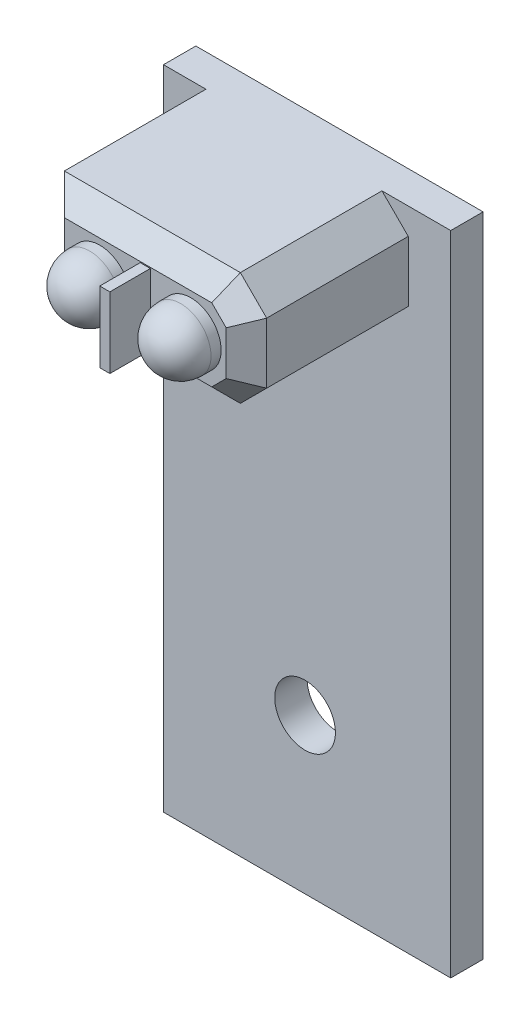
ISO-10303-21;
HEADER;
FILE_DESCRIPTION(('STEP AP214'),'2;1');
FILE_NAME('part.step','',(''),(''),'','','');
FILE_SCHEMA(('AUTOMOTIVE_DESIGN { 1 0 10303 214 1 1 1 1 }'));
ENDSEC;
DATA;
#1=APPLICATION_CONTEXT('core data for automotive mechanical design processes');
#2=APPLICATION_PROTOCOL_DEFINITION('international standard','automotive_design',2000,#1);
#3=PRODUCT_CONTEXT('',#1,'mechanical');
#4=PRODUCT('Part','Part','',(#3));
#5=PRODUCT_RELATED_PRODUCT_CATEGORY('part','',(#4));
#6=PRODUCT_DEFINITION_FORMATION('','',#4);
#7=PRODUCT_DEFINITION_CONTEXT('part definition',#1,'design');
#8=PRODUCT_DEFINITION('design','',#6,#7);
#9=PRODUCT_DEFINITION_SHAPE('','',#8);
#10=(LENGTH_UNIT() NAMED_UNIT(*) SI_UNIT(.MILLI.,.METRE.));
#11=(NAMED_UNIT(*) PLANE_ANGLE_UNIT() SI_UNIT($,.RADIAN.));
#12=(NAMED_UNIT(*) SI_UNIT($,.STERADIAN.) SOLID_ANGLE_UNIT());
#13=UNCERTAINTY_MEASURE_WITH_UNIT(LENGTH_MEASURE(1.E-05),#10,'distance_accuracy_value','');
#14=(GEOMETRIC_REPRESENTATION_CONTEXT(3) GLOBAL_UNCERTAINTY_ASSIGNED_CONTEXT((#13)) GLOBAL_UNIT_ASSIGNED_CONTEXT((#10,
#11,#12)) REPRESENTATION_CONTEXT('',''));
#15=CARTESIAN_POINT('',(0.,0.,0.));
#16=DIRECTION('',(0.,0.,1.));
#17=DIRECTION('',(1.,0.,0.));
#18=AXIS2_PLACEMENT_3D('',#15,#16,#17);
#19=CARTESIAN_POINT('',(0.,0.,0.));
#20=DIRECTION('',(0.,0.,-1.));
#21=DIRECTION('',(-1.,0.,0.));
#22=AXIS2_PLACEMENT_3D('',#19,#20,#21);
#23=PLANE('',#22);
#24=DIRECTION('',(0.,1.,0.));
#25=VECTOR('',#24,1.);
#26=CARTESIAN_POINT('',(7.1,-16.,0.));
#27=LINE('',#26,#25);
#28=CARTESIAN_POINT('',(7.1,-16.,0.));
#29=VERTEX_POINT('',#28);
#30=CARTESIAN_POINT('',(7.1,16.,0.));
#31=VERTEX_POINT('',#30);
#32=EDGE_CURVE('E320',#29,#31,#27,.T.);
#33=ORIENTED_EDGE('',*,*,#32,.F.);
#34=DIRECTION('',(1.,0.,0.));
#35=VECTOR('',#34,1.);
#36=CARTESIAN_POINT('',(-7.1,-16.,0.));
#37=LINE('',#36,#35);
#38=CARTESIAN_POINT('',(-7.1,-16.,0.));
#39=VERTEX_POINT('',#38);
#40=EDGE_CURVE('E328',#39,#29,#37,.T.);
#41=ORIENTED_EDGE('',*,*,#40,.F.);
#42=DIRECTION('',(0.,-1.,0.));
#43=VECTOR('',#42,1.);
#44=CARTESIAN_POINT('',(-7.1,-16.,0.));
#45=LINE('',#44,#43);
#46=CARTESIAN_POINT('',(-7.1,16.,0.));
#47=VERTEX_POINT('',#46);
#48=EDGE_CURVE('E326',#47,#39,#45,.T.);
#49=ORIENTED_EDGE('',*,*,#48,.F.);
#50=DIRECTION('',(-1.,0.,0.));
#51=VECTOR('',#50,1.);
#52=CARTESIAN_POINT('',(-7.1,16.,0.));
#53=LINE('',#52,#51);
#54=EDGE_CURVE('E323',#31,#47,#53,.T.);
#55=ORIENTED_EDGE('',*,*,#54,.F.);
#56=EDGE_LOOP('',(#33,#41,#49,#55));
#57=FACE_BOUND('',#56,.T.);
#58=CARTESIAN_POINT('',(-0.100000000000002,-8.35,0.));
#59=DIRECTION('',(0.,0.,1.));
#60=DIRECTION('',(1.,0.,0.));
#61=AXIS2_PLACEMENT_3D('',#58,#59,#60);
#62=CIRCLE('',#61,1.5);
#63=CARTESIAN_POINT('',(1.4,-8.35,0.));
#64=VERTEX_POINT('',#63);
#65=EDGE_CURVE('E324',#64,#64,#62,.T.);
#66=ORIENTED_EDGE('',*,*,#65,.T.);
#67=EDGE_LOOP('',(#66));
#68=FACE_BOUND('',#67,.T.);
#69=DIRECTION('',(1.,0.,0.));
#70=VECTOR('',#69,1.);
#71=CARTESIAN_POINT('',(0.399999999999997,4.,0.));
#72=LINE('',#71,#70);
#73=CARTESIAN_POINT('',(-6.6,4.,0.));
#74=VERTEX_POINT('',#73);
#75=CARTESIAN_POINT('',(0.399999999999997,4.,0.));
#76=VERTEX_POINT('',#75);
#77=EDGE_CURVE('E738',#74,#76,#72,.T.);
#78=ORIENTED_EDGE('',*,*,#77,.F.);
#79=DIRECTION('',(0.,1.,0.));
#80=VECTOR('',#79,1.);
#81=CARTESIAN_POINT('',(-6.6,-3.00000000000001,0.));
#82=LINE('',#81,#80);
#83=CARTESIAN_POINT('',(-6.6,-3.00000000000001,0.));
#84=VERTEX_POINT('',#83);
#85=EDGE_CURVE('E200',#84,#74,#82,.T.);
#86=ORIENTED_EDGE('',*,*,#85,.F.);
#87=DIRECTION('',(-1.,0.,0.));
#88=VECTOR('',#87,1.);
#89=CARTESIAN_POINT('',(0.399999999999997,-3.00000000000001,0.));
#90=LINE('',#89,#88);
#91=CARTESIAN_POINT('',(0.399999999999997,-3.00000000000001,0.));
#92=VERTEX_POINT('',#91);
#93=EDGE_CURVE('E196',#92,#84,#90,.T.);
#94=ORIENTED_EDGE('',*,*,#93,.F.);
#95=DIRECTION('',(0.,-1.,0.));
#96=VECTOR('',#95,1.);
#97=CARTESIAN_POINT('',(0.399999999999997,-3.00000000000001,0.));
#98=LINE('',#97,#96);
#99=EDGE_CURVE('E735',#76,#92,#98,.T.);
#100=ORIENTED_EDGE('',*,*,#99,.F.);
#101=EDGE_LOOP('',(#78,#86,#94,#100));
#102=FACE_BOUND('',#101,.T.);
#103=ADVANCED_FACE('F33',(#57,#68,#102),#23,.T.);
#104=CARTESIAN_POINT('',(-7.1,16.,1.6));
#105=DIRECTION('',(0.,-1.,0.));
#106=DIRECTION('',(0.,0.,-1.));
#107=AXIS2_PLACEMENT_3D('',#104,#105,#106);
#108=PLANE('',#107);
#109=DIRECTION('',(0.,0.,-1.));
#110=VECTOR('',#109,1.);
#111=CARTESIAN_POINT('',(-5.,16.,11.6));
#112=LINE('',#111,#110);
#113=CARTESIAN_POINT('',(-5.,16.,8.6));
#114=VERTEX_POINT('',#113);
#115=CARTESIAN_POINT('',(-5.,16.,1.6));
#116=VERTEX_POINT('',#115);
#117=EDGE_CURVE('E268',#114,#116,#112,.T.);
#118=ORIENTED_EDGE('',*,*,#117,.F.);
#119=DIRECTION('',(1.,0.,0.));
#120=VECTOR('',#119,1.);
#121=CARTESIAN_POINT('',(3.70000000000001,16.,8.6));
#122=LINE('',#121,#120);
#123=CARTESIAN_POINT('',(3.70000000000001,16.,8.6));
#124=VERTEX_POINT('',#123);
#125=EDGE_CURVE('E367',#114,#124,#122,.T.);
#126=ORIENTED_EDGE('',*,*,#125,.T.);
#127=DIRECTION('',(0.,0.,-1.));
#128=VECTOR('',#127,1.);
#129=CARTESIAN_POINT('',(3.70000000000001,16.,11.6));
#130=LINE('',#129,#128);
#131=CARTESIAN_POINT('',(3.70000000000001,16.,1.6));
#132=VERTEX_POINT('',#131);
#133=EDGE_CURVE('E286',#124,#132,#130,.T.);
#134=ORIENTED_EDGE('',*,*,#133,.T.);
#135=DIRECTION('',(-1.,0.,0.));
#136=VECTOR('',#135,1.);
#137=CARTESIAN_POINT('',(-7.1,16.,1.6));
#138=LINE('',#137,#136);
#139=CARTESIAN_POINT('',(7.1,16.,1.6));
#140=VERTEX_POINT('',#139);
#141=EDGE_CURVE('E307',#140,#132,#138,.T.);
#142=ORIENTED_EDGE('',*,*,#141,.F.);
#143=DIRECTION('',(0.,0.,-1.));
#144=VECTOR('',#143,1.);
#145=CARTESIAN_POINT('',(7.1,16.,1.6));
#146=LINE('',#145,#144);
#147=EDGE_CURVE('E274',#140,#31,#146,.T.);
#148=ORIENTED_EDGE('',*,*,#147,.T.);
#149=ORIENTED_EDGE('',*,*,#54,.T.);
#150=DIRECTION('',(0.,0.,-1.));
#151=VECTOR('',#150,1.);
#152=CARTESIAN_POINT('',(-7.1,16.,1.6));
#153=LINE('',#152,#151);
#154=CARTESIAN_POINT('',(-7.1,16.,1.6));
#155=VERTEX_POINT('',#154);
#156=EDGE_CURVE('E335',#155,#47,#153,.T.);
#157=ORIENTED_EDGE('',*,*,#156,.F.);
#158=EDGE_CURVE('E304',#116,#155,#138,.T.);
#159=ORIENTED_EDGE('',*,*,#158,.F.);
#160=EDGE_LOOP('',(#118,#126,#134,#142,#148,#149,#157,#159));
#161=FACE_BOUND('',#160,.T.);
#162=ADVANCED_FACE('F340',(#161),#108,.F.);
#163=CARTESIAN_POINT('',(-5.,16.,11.6));
#164=DIRECTION('',(1.,0.,0.));
#165=DIRECTION('',(0.,1.,0.));
#166=AXIS2_PLACEMENT_3D('',#163,#164,#165);
#167=PLANE('',#166);
#168=DIRECTION('',(0.,0.,-1.));
#169=VECTOR('',#168,1.);
#170=CARTESIAN_POINT('',(-5.,10.4,11.6));
#171=LINE('',#170,#169);
#172=CARTESIAN_POINT('',(-5.,10.4,8.6));
#173=VERTEX_POINT('',#172);
#174=CARTESIAN_POINT('',(-5.,10.4,1.6));
#175=VERTEX_POINT('',#174);
#176=EDGE_CURVE('E403',#173,#175,#171,.T.);
#177=ORIENTED_EDGE('',*,*,#176,.F.);
#178=DIRECTION('',(0.,1.,0.));
#179=VECTOR('',#178,1.);
#180=CARTESIAN_POINT('',(-5.,16.,8.6));
#181=LINE('',#180,#179);
#182=EDGE_CURVE('E56',#173,#114,#181,.T.);
#183=ORIENTED_EDGE('',*,*,#182,.T.);
#184=ORIENTED_EDGE('',*,*,#117,.T.);
#185=DIRECTION('',(0.,-1.,0.));
#186=VECTOR('',#185,1.);
#187=CARTESIAN_POINT('',(-5.,16.,1.6));
#188=LINE('',#187,#186);
#189=EDGE_CURVE('E249',#116,#175,#188,.T.);
#190=ORIENTED_EDGE('',*,*,#189,.T.);
#191=EDGE_LOOP('',(#177,#183,#184,#190));
#192=FACE_BOUND('',#191,.T.);
#193=ADVANCED_FACE('F405',(#192),#167,.F.);
#194=CARTESIAN_POINT('',(-5.,10.4,11.6));
#195=DIRECTION('',(0.,1.,0.));
#196=DIRECTION('',(0.,0.,1.));
#197=AXIS2_PLACEMENT_3D('',#194,#195,#196);
#198=PLANE('',#197);
#199=DIRECTION('',(0.,0.,-1.));
#200=VECTOR('',#199,1.);
#201=CARTESIAN_POINT('',(3.70000000000001,10.4,11.6));
#202=LINE('',#201,#200);
#203=CARTESIAN_POINT('',(3.70000000000001,10.4,8.6));
#204=VERTEX_POINT('',#203);
#205=CARTESIAN_POINT('',(3.70000000000001,10.4,1.6));
#206=VERTEX_POINT('',#205);
#207=EDGE_CURVE('E404',#204,#206,#202,.T.);
#208=ORIENTED_EDGE('',*,*,#207,.F.);
#209=DIRECTION('',(-1.,0.,0.));
#210=VECTOR('',#209,1.);
#211=CARTESIAN_POINT('',(-5.,10.4,8.6));
#212=LINE('',#211,#210);
#213=EDGE_CURVE('E294',#204,#173,#212,.T.);
#214=ORIENTED_EDGE('',*,*,#213,.T.);
#215=ORIENTED_EDGE('',*,*,#176,.T.);
#216=DIRECTION('',(1.,0.,0.));
#217=VECTOR('',#216,1.);
#218=CARTESIAN_POINT('',(-5.,10.4,1.6));
#219=LINE('',#218,#217);
#220=EDGE_CURVE('E250',#175,#206,#219,.T.);
#221=ORIENTED_EDGE('',*,*,#220,.T.);
#222=EDGE_LOOP('',(#208,#214,#215,#221));
#223=FACE_BOUND('',#222,.T.);
#224=ADVANCED_FACE('F402',(#223),#198,.F.);
#225=CARTESIAN_POINT('',(5.,11.7,11.6));
#226=DIRECTION('',(0.707106781186552,-0.707106781186543,0.));
#227=DIRECTION('',(0.707106781186543,0.707106781186552,0.));
#228=AXIS2_PLACEMENT_3D('',#225,#226,#227);
#229=PLANE('',#228);
#230=DIRECTION('',(0.,0.,-1.));
#231=VECTOR('',#230,1.);
#232=CARTESIAN_POINT('',(5.,11.7,11.6));
#233=LINE('',#232,#231);
#234=CARTESIAN_POINT('',(5.,11.7,8.6));
#235=VERTEX_POINT('',#234);
#236=CARTESIAN_POINT('',(5.,11.7,1.6));
#237=VERTEX_POINT('',#236);
#238=EDGE_CURVE('E409',#235,#237,#233,.T.);
#239=ORIENTED_EDGE('',*,*,#238,.F.);
#240=DIRECTION('',(-0.707106781186543,-0.707106781186552,0.));
#241=VECTOR('',#240,1.);
#242=CARTESIAN_POINT('',(5.,11.7,8.6));
#243=LINE('',#242,#241);
#244=EDGE_CURVE('E292',#235,#204,#243,.T.);
#245=ORIENTED_EDGE('',*,*,#244,.T.);
#246=ORIENTED_EDGE('',*,*,#207,.T.);
#247=DIRECTION('',(-0.707106781186543,-0.707106781186552,0.));
#248=VECTOR('',#247,1.);
#249=CARTESIAN_POINT('',(5.,11.7,1.6));
#250=LINE('',#249,#248);
#251=EDGE_CURVE('E253',#237,#206,#250,.T.);
#252=ORIENTED_EDGE('',*,*,#251,.F.);
#253=EDGE_LOOP('',(#239,#245,#246,#252));
#254=FACE_BOUND('',#253,.T.);
#255=ADVANCED_FACE('F497',(#254),#229,.T.);
#256=CARTESIAN_POINT('',(5.,14.7,11.6));
#257=DIRECTION('',(1.,0.,0.));
#258=DIRECTION('',(0.,1.,0.));
#259=AXIS2_PLACEMENT_3D('',#256,#257,#258);
#260=PLANE('',#259);
#261=DIRECTION('',(0.,0.,-1.));
#262=VECTOR('',#261,1.);
#263=CARTESIAN_POINT('',(5.,14.7,11.6));
#264=LINE('',#263,#262);
#265=CARTESIAN_POINT('',(5.,14.7,8.6));
#266=VERTEX_POINT('',#265);
#267=CARTESIAN_POINT('',(5.,14.7,1.6));
#268=VERTEX_POINT('',#267);
#269=EDGE_CURVE('E262',#266,#268,#264,.T.);
#270=ORIENTED_EDGE('',*,*,#269,.F.);
#271=DIRECTION('',(0.,-1.,0.));
#272=VECTOR('',#271,1.);
#273=CARTESIAN_POINT('',(5.,14.7,8.6));
#274=LINE('',#273,#272);
#275=EDGE_CURVE('E290',#266,#235,#274,.T.);
#276=ORIENTED_EDGE('',*,*,#275,.T.);
#277=ORIENTED_EDGE('',*,*,#238,.T.);
#278=DIRECTION('',(0.,-1.,0.));
#279=VECTOR('',#278,1.);
#280=CARTESIAN_POINT('',(5.,14.7,1.6));
#281=LINE('',#280,#279);
#282=EDGE_CURVE('E256',#268,#237,#281,.T.);
#283=ORIENTED_EDGE('',*,*,#282,.F.);
#284=EDGE_LOOP('',(#270,#276,#277,#283));
#285=FACE_BOUND('',#284,.T.);
#286=ADVANCED_FACE('F431',(#285),#260,.T.);
#287=CARTESIAN_POINT('',(5.,14.7,11.6));
#288=DIRECTION('',(-0.707106781186551,-0.707106781186544,0.));
#289=DIRECTION('',(0.707106781186544,-0.707106781186551,0.));
#290=AXIS2_PLACEMENT_3D('',#287,#288,#289);
#291=PLANE('',#290);
#292=ORIENTED_EDGE('',*,*,#133,.F.);
#293=DIRECTION('',(0.707106781186544,-0.707106781186551,0.));
#294=VECTOR('',#293,1.);
#295=CARTESIAN_POINT('',(5.,14.7,8.6));
#296=LINE('',#295,#294);
#297=EDGE_CURVE('E285',#124,#266,#296,.T.);
#298=ORIENTED_EDGE('',*,*,#297,.T.);
#299=ORIENTED_EDGE('',*,*,#269,.T.);
#300=DIRECTION('',(-0.707106781186544,0.707106781186551,0.));
#301=VECTOR('',#300,1.);
#302=CARTESIAN_POINT('',(5.,14.7,1.6));
#303=LINE('',#302,#301);
#304=EDGE_CURVE('E259',#268,#132,#303,.T.);
#305=ORIENTED_EDGE('',*,*,#304,.T.);
#306=EDGE_LOOP('',(#292,#298,#299,#305));
#307=FACE_BOUND('',#306,.T.);
#308=ADVANCED_FACE('F424',(#307),#291,.F.);
#309=CARTESIAN_POINT('',(0.,0.,1.6));
#310=DIRECTION('',(0.,0.,-1.));
#311=DIRECTION('',(-1.,0.,0.));
#312=AXIS2_PLACEMENT_3D('',#309,#310,#311);
#313=PLANE('',#312);
#314=CARTESIAN_POINT('',(-0.100000000000002,-8.35,1.6));
#315=DIRECTION('',(0.,0.,1.));
#316=DIRECTION('',(1.,0.,0.));
#317=AXIS2_PLACEMENT_3D('',#314,#315,#316);
#318=CIRCLE('',#317,1.5);
#319=CARTESIAN_POINT('',(1.4,-8.35,1.6));
#320=VERTEX_POINT('',#319);
#321=EDGE_CURVE('E406',#320,#320,#318,.T.);
#322=ORIENTED_EDGE('',*,*,#321,.F.);
#323=EDGE_LOOP('',(#322));
#324=FACE_BOUND('',#323,.T.);
#325=ORIENTED_EDGE('',*,*,#189,.F.);
#326=ORIENTED_EDGE('',*,*,#158,.T.);
#327=DIRECTION('',(0.,-1.,0.));
#328=VECTOR('',#327,1.);
#329=CARTESIAN_POINT('',(-7.1,-16.,1.6));
#330=LINE('',#329,#328);
#331=CARTESIAN_POINT('',(-7.1,-16.,1.6));
#332=VERTEX_POINT('',#331);
#333=EDGE_CURVE('E314',#155,#332,#330,.T.);
#334=ORIENTED_EDGE('',*,*,#333,.T.);
#335=DIRECTION('',(1.,0.,0.));
#336=VECTOR('',#335,1.);
#337=CARTESIAN_POINT('',(-7.1,-16.,1.6));
#338=LINE('',#337,#336);
#339=CARTESIAN_POINT('',(7.1,-16.,1.6));
#340=VERTEX_POINT('',#339);
#341=EDGE_CURVE('E317',#332,#340,#338,.T.);
#342=ORIENTED_EDGE('',*,*,#341,.T.);
#343=DIRECTION('',(0.,1.,0.));
#344=VECTOR('',#343,1.);
#345=CARTESIAN_POINT('',(7.1,-16.,1.6));
#346=LINE('',#345,#344);
#347=EDGE_CURVE('E308',#340,#140,#346,.T.);
#348=ORIENTED_EDGE('',*,*,#347,.T.);
#349=ORIENTED_EDGE('',*,*,#141,.T.);
#350=ORIENTED_EDGE('',*,*,#304,.F.);
#351=ORIENTED_EDGE('',*,*,#282,.T.);
#352=ORIENTED_EDGE('',*,*,#251,.T.);
#353=ORIENTED_EDGE('',*,*,#220,.F.);
#354=EDGE_LOOP('',(#325,#326,#334,#342,#348,#349,#350,#351,#352,#353));
#355=FACE_BOUND('',#354,.T.);
#356=ADVANCED_FACE('F362',(#324,#355),#313,.F.);
#357=CARTESIAN_POINT('',(7.1,-16.,1.6));
#358=DIRECTION('',(-1.,0.,0.));
#359=DIRECTION('',(0.,0.,1.));
#360=AXIS2_PLACEMENT_3D('',#357,#358,#359);
#361=PLANE('',#360);
#362=ORIENTED_EDGE('',*,*,#32,.T.);
#363=ORIENTED_EDGE('',*,*,#147,.F.);
#364=ORIENTED_EDGE('',*,*,#347,.F.);
#365=DIRECTION('',(0.,0.,-1.));
#366=VECTOR('',#365,1.);
#367=CARTESIAN_POINT('',(7.1,-16.,1.6));
#368=LINE('',#367,#366);
#369=EDGE_CURVE('E319',#340,#29,#368,.T.);
#370=ORIENTED_EDGE('',*,*,#369,.T.);
#371=EDGE_LOOP('',(#362,#363,#364,#370));
#372=FACE_BOUND('',#371,.T.);
#373=ADVANCED_FACE('F347',(#372),#361,.F.);
#374=CARTESIAN_POINT('',(-7.1,-16.,1.6));
#375=DIRECTION('',(1.,0.,0.));
#376=DIRECTION('',(0.,0.,-1.));
#377=AXIS2_PLACEMENT_3D('',#374,#375,#376);
#378=PLANE('',#377);
#379=ORIENTED_EDGE('',*,*,#48,.T.);
#380=DIRECTION('',(0.,0.,-1.));
#381=VECTOR('',#380,1.);
#382=CARTESIAN_POINT('',(-7.1,-16.,1.6));
#383=LINE('',#382,#381);
#384=EDGE_CURVE('E332',#332,#39,#383,.T.);
#385=ORIENTED_EDGE('',*,*,#384,.F.);
#386=ORIENTED_EDGE('',*,*,#333,.F.);
#387=ORIENTED_EDGE('',*,*,#156,.T.);
#388=EDGE_LOOP('',(#379,#385,#386,#387));
#389=FACE_BOUND('',#388,.T.);
#390=ADVANCED_FACE('F355',(#389),#378,.F.);
#391=CARTESIAN_POINT('',(-7.1,-16.,1.6));
#392=DIRECTION('',(0.,1.,0.));
#393=DIRECTION('',(0.,0.,1.));
#394=AXIS2_PLACEMENT_3D('',#391,#392,#393);
#395=PLANE('',#394);
#396=ORIENTED_EDGE('',*,*,#40,.T.);
#397=ORIENTED_EDGE('',*,*,#369,.F.);
#398=ORIENTED_EDGE('',*,*,#341,.F.);
#399=ORIENTED_EDGE('',*,*,#384,.T.);
#400=EDGE_LOOP('',(#396,#397,#398,#399));
#401=FACE_BOUND('',#400,.T.);
#402=ADVANCED_FACE('F359',(#401),#395,.F.);
#403=CARTESIAN_POINT('',(-0.100000000000002,-8.35,0.));
#404=DIRECTION('',(0.,0.,1.));
#405=DIRECTION('',(1.,0.,0.));
#406=AXIS2_PLACEMENT_3D('',#403,#404,#405);
#407=CYLINDRICAL_SURFACE('',#406,1.5);
#408=ORIENTED_EDGE('',*,*,#65,.F.);
#409=EDGE_LOOP('',(#408));
#410=FACE_BOUND('',#409,.T.);
#411=ORIENTED_EDGE('',*,*,#321,.T.);
#412=EDGE_LOOP('',(#411));
#413=FACE_BOUND('',#412,.T.);
#414=ADVANCED_FACE('F416',(#410,#413),#407,.F.);
#415=CARTESIAN_POINT('',(0.,0.,9.6));
#416=DIRECTION('',(0.,0.,1.));
#417=DIRECTION('',(1.,0.,0.));
#418=AXIS2_PLACEMENT_3D('',#415,#416,#417);
#419=PLANE('',#418);
#420=DIRECTION('',(0.,1.,0.));
#421=VECTOR('',#420,1.);
#422=CARTESIAN_POINT('',(4.,0.,9.6));
#423=LINE('',#422,#421);
#424=CARTESIAN_POINT('',(4.,12.1142135623731,9.6));
#425=VERTEX_POINT('',#424);
#426=CARTESIAN_POINT('',(4.,14.2857864376269,9.6));
#427=VERTEX_POINT('',#426);
#428=EDGE_CURVE('E280',#425,#427,#423,.T.);
#429=ORIENTED_EDGE('',*,*,#428,.T.);
#430=DIRECTION('',(-0.707106781186544,0.707106781186551,0.));
#431=VECTOR('',#430,1.);
#432=CARTESIAN_POINT('',(2.99289321881346,15.2928932188135,9.6));
#433=LINE('',#432,#431);
#434=CARTESIAN_POINT('',(3.28578643762691,15.,9.6));
#435=VERTEX_POINT('',#434);
#436=EDGE_CURVE('E282',#427,#435,#433,.T.);
#437=ORIENTED_EDGE('',*,*,#436,.T.);
#438=DIRECTION('',(-1.,0.,0.));
#439=VECTOR('',#438,1.);
#440=CARTESIAN_POINT('',(-5.,15.,9.6));
#441=LINE('',#440,#439);
#442=CARTESIAN_POINT('',(-4.00000000000001,15.,9.6));
#443=VERTEX_POINT('',#442);
#444=EDGE_CURVE('E271',#435,#443,#441,.T.);
#445=ORIENTED_EDGE('',*,*,#444,.T.);
#446=DIRECTION('',(0.,-1.,0.));
#447=VECTOR('',#446,1.);
#448=CARTESIAN_POINT('',(-4.00000000000001,10.4,9.6));
#449=LINE('',#448,#447);
#450=CARTESIAN_POINT('',(-4.00000000000001,11.4,9.6));
#451=VERTEX_POINT('',#450);
#452=EDGE_CURVE('E273',#443,#451,#449,.T.);
#453=ORIENTED_EDGE('',*,*,#452,.T.);
#454=DIRECTION('',(1.,0.,0.));
#455=VECTOR('',#454,1.);
#456=CARTESIAN_POINT('',(3.70000000000001,11.4,9.6));
#457=LINE('',#456,#455);
#458=CARTESIAN_POINT('',(3.28578643762692,11.4,9.6));
#459=VERTEX_POINT('',#458);
#460=EDGE_CURVE('E276',#451,#459,#457,.T.);
#461=ORIENTED_EDGE('',*,*,#460,.T.);
#462=DIRECTION('',(0.707106781186543,0.707106781186552,0.));
#463=VECTOR('',#462,1.);
#464=CARTESIAN_POINT('',(-4.05710678118651,4.05710678118646,9.6));
#465=LINE('',#464,#463);
#466=EDGE_CURVE('E278',#459,#425,#465,.T.);
#467=ORIENTED_EDGE('',*,*,#466,.T.);
#468=EDGE_LOOP('',(#429,#437,#445,#453,#461,#467));
#469=FACE_BOUND('',#468,.T.);
#470=DIRECTION('',(1.,0.,0.));
#471=VECTOR('',#470,1.);
#472=CARTESIAN_POINT('',(-0.25,11.45,9.6));
#473=LINE('',#472,#471);
#474=CARTESIAN_POINT('',(-0.25,11.45,9.6));
#475=VERTEX_POINT('',#474);
#476=CARTESIAN_POINT('',(0.25,11.45,9.6));
#477=VERTEX_POINT('',#476);
#478=EDGE_CURVE('E219',#475,#477,#473,.T.);
#479=ORIENTED_EDGE('',*,*,#478,.F.);
#480=DIRECTION('',(0.,-1.,0.));
#481=VECTOR('',#480,1.);
#482=CARTESIAN_POINT('',(-0.250000000000001,14.95,9.6));
#483=LINE('',#482,#481);
#484=CARTESIAN_POINT('',(-0.250000000000001,14.95,9.6));
#485=VERTEX_POINT('',#484);
#486=EDGE_CURVE('E216',#485,#475,#483,.T.);
#487=ORIENTED_EDGE('',*,*,#486,.F.);
#488=DIRECTION('',(-1.,0.,0.));
#489=VECTOR('',#488,1.);
#490=CARTESIAN_POINT('',(-0.250000000000001,14.95,9.6));
#491=LINE('',#490,#489);
#492=CARTESIAN_POINT('',(0.249999999999999,14.95,9.6));
#493=VERTEX_POINT('',#492);
#494=EDGE_CURVE('E212',#493,#485,#491,.T.);
#495=ORIENTED_EDGE('',*,*,#494,.F.);
#496=DIRECTION('',(0.,1.,0.));
#497=VECTOR('',#496,1.);
#498=CARTESIAN_POINT('',(0.249999999999999,14.95,9.6));
#499=LINE('',#498,#497);
#500=EDGE_CURVE('E209',#477,#493,#499,.T.);
#501=ORIENTED_EDGE('',*,*,#500,.F.);
#502=EDGE_LOOP('',(#479,#487,#495,#501));
#503=FACE_BOUND('',#502,.T.);
#504=CARTESIAN_POINT('',(2.25,13.2,9.6));
#505=DIRECTION('',(0.,0.,1.));
#506=DIRECTION('',(1.,0.,0.));
#507=AXIS2_PLACEMENT_3D('',#504,#505,#506);
#508=CIRCLE('',#507,1.5);
#509=CARTESIAN_POINT('',(3.75,13.2,9.6));
#510=VERTEX_POINT('',#509);
#511=EDGE_CURVE('E237',#510,#510,#508,.T.);
#512=ORIENTED_EDGE('',*,*,#511,.F.);
#513=EDGE_LOOP('',(#512));
#514=FACE_BOUND('',#513,.T.);
#515=CARTESIAN_POINT('',(-2.25,13.2,9.6));
#516=DIRECTION('',(0.,0.,1.));
#517=DIRECTION('',(1.,0.,0.));
#518=AXIS2_PLACEMENT_3D('',#515,#516,#517);
#519=CIRCLE('',#518,1.5);
#520=CARTESIAN_POINT('',(-0.750000000000003,13.2,9.6));
#521=VERTEX_POINT('',#520);
#522=EDGE_CURVE('E246',#521,#521,#519,.T.);
#523=ORIENTED_EDGE('',*,*,#522,.F.);
#524=EDGE_LOOP('',(#523));
#525=FACE_BOUND('',#524,.T.);
#526=ADVANCED_FACE('F419',(#469,#503,#514,#525),#419,.T.);
#527=CARTESIAN_POINT('',(-2.25,13.2,9.6));
#528=DIRECTION('',(0.,0.,1.));
#529=DIRECTION('',(1.,0.,0.));
#530=AXIS2_PLACEMENT_3D('',#527,#528,#529);
#531=CYLINDRICAL_SURFACE('',#530,1.5);
#532=CARTESIAN_POINT('',(-2.25,13.2,10.1));
#533=DIRECTION('',(0.,0.,1.));
#534=DIRECTION('',(1.,0.,0.));
#535=AXIS2_PLACEMENT_3D('',#532,#533,#534);
#536=CIRCLE('',#535,1.5);
#537=CARTESIAN_POINT('',(-0.750000000000003,13.2,10.1));
#538=VERTEX_POINT('',#537);
#539=EDGE_CURVE('E11',#538,#538,#536,.F.);
#540=ORIENTED_EDGE('',*,*,#539,.T.);
#541=EDGE_LOOP('',(#540));
#542=FACE_BOUND('',#541,.T.);
#543=ORIENTED_EDGE('',*,*,#522,.T.);
#544=EDGE_LOOP('',(#543));
#545=FACE_BOUND('',#544,.T.);
#546=ADVANCED_FACE('F474',(#542,#545),#531,.T.);
#547=CARTESIAN_POINT('',(2.25,13.2,9.6));
#548=DIRECTION('',(0.,0.,1.));
#549=DIRECTION('',(1.,0.,0.));
#550=AXIS2_PLACEMENT_3D('',#547,#548,#549);
#551=CYLINDRICAL_SURFACE('',#550,1.5);
#552=CARTESIAN_POINT('',(2.25,13.2,10.1));
#553=DIRECTION('',(0.,0.,1.));
#554=DIRECTION('',(1.,0.,0.));
#555=AXIS2_PLACEMENT_3D('',#552,#553,#554);
#556=CIRCLE('',#555,1.5);
#557=CARTESIAN_POINT('',(3.75,13.2,10.1));
#558=VERTEX_POINT('',#557);
#559=EDGE_CURVE('E41',#558,#558,#556,.F.);
#560=ORIENTED_EDGE('',*,*,#559,.T.);
#561=EDGE_LOOP('',(#560));
#562=FACE_BOUND('',#561,.T.);
#563=ORIENTED_EDGE('',*,*,#511,.T.);
#564=EDGE_LOOP('',(#563));
#565=FACE_BOUND('',#564,.T.);
#566=ADVANCED_FACE('F470',(#562,#565),#551,.T.);
#567=CARTESIAN_POINT('',(0.249999999999999,14.95,9.6));
#568=DIRECTION('',(1.,0.,0.));
#569=DIRECTION('',(0.,1.,0.));
#570=AXIS2_PLACEMENT_3D('',#567,#568,#569);
#571=PLANE('',#570);
#572=DIRECTION('',(0.,1.,0.));
#573=VECTOR('',#572,1.);
#574=CARTESIAN_POINT('',(0.249999999999999,14.95,11.6));
#575=LINE('',#574,#573);
#576=CARTESIAN_POINT('',(0.25,11.45,11.6));
#577=VERTEX_POINT('',#576);
#578=CARTESIAN_POINT('',(0.249999999999999,14.95,11.6));
#579=VERTEX_POINT('',#578);
#580=EDGE_CURVE('E223',#577,#579,#575,.T.);
#581=ORIENTED_EDGE('',*,*,#580,.F.);
#582=DIRECTION('',(0.,0.,1.));
#583=VECTOR('',#582,1.);
#584=CARTESIAN_POINT('',(0.25,11.45,9.6));
#585=LINE('',#584,#583);
#586=EDGE_CURVE('E235',#477,#577,#585,.T.);
#587=ORIENTED_EDGE('',*,*,#586,.F.);
#588=ORIENTED_EDGE('',*,*,#500,.T.);
#589=DIRECTION('',(0.,0.,1.));
#590=VECTOR('',#589,1.);
#591=CARTESIAN_POINT('',(0.249999999999999,14.95,9.6));
#592=LINE('',#591,#590);
#593=EDGE_CURVE('E222',#493,#579,#592,.T.);
#594=ORIENTED_EDGE('',*,*,#593,.T.);
#595=EDGE_LOOP('',(#581,#587,#588,#594));
#596=FACE_BOUND('',#595,.T.);
#597=ADVANCED_FACE('F473',(#596),#571,.T.);
#598=CARTESIAN_POINT('',(-0.25,11.45,9.6));
#599=DIRECTION('',(0.,-1.,0.));
#600=DIRECTION('',(0.,0.,-1.));
#601=AXIS2_PLACEMENT_3D('',#598,#599,#600);
#602=PLANE('',#601);
#603=DIRECTION('',(1.,0.,0.));
#604=VECTOR('',#603,1.);
#605=CARTESIAN_POINT('',(-0.25,11.45,11.6));
#606=LINE('',#605,#604);
#607=CARTESIAN_POINT('',(-0.25,11.45,11.6));
#608=VERTEX_POINT('',#607);
#609=EDGE_CURVE('E213',#608,#577,#606,.T.);
#610=ORIENTED_EDGE('',*,*,#609,.F.);
#611=DIRECTION('',(0.,0.,1.));
#612=VECTOR('',#611,1.);
#613=CARTESIAN_POINT('',(-0.25,11.45,9.6));
#614=LINE('',#613,#612);
#615=EDGE_CURVE('E238',#475,#608,#614,.T.);
#616=ORIENTED_EDGE('',*,*,#615,.F.);
#617=ORIENTED_EDGE('',*,*,#478,.T.);
#618=ORIENTED_EDGE('',*,*,#586,.T.);
#619=EDGE_LOOP('',(#610,#616,#617,#618));
#620=FACE_BOUND('',#619,.T.);
#621=ADVANCED_FACE('F644',(#620),#602,.T.);
#622=CARTESIAN_POINT('',(-0.250000000000001,14.95,9.6));
#623=DIRECTION('',(-1.,0.,0.));
#624=DIRECTION('',(0.,-1.,0.));
#625=AXIS2_PLACEMENT_3D('',#622,#623,#624);
#626=PLANE('',#625);
#627=DIRECTION('',(0.,-1.,0.));
#628=VECTOR('',#627,1.);
#629=CARTESIAN_POINT('',(-0.250000000000001,14.95,11.6));
#630=LINE('',#629,#628);
#631=CARTESIAN_POINT('',(-0.250000000000001,14.95,11.6));
#632=VERTEX_POINT('',#631);
#633=EDGE_CURVE('E230',#632,#608,#630,.T.);
#634=ORIENTED_EDGE('',*,*,#633,.F.);
#635=DIRECTION('',(0.,0.,1.));
#636=VECTOR('',#635,1.);
#637=CARTESIAN_POINT('',(-0.250000000000001,14.95,9.6));
#638=LINE('',#637,#636);
#639=EDGE_CURVE('E240',#485,#632,#638,.T.);
#640=ORIENTED_EDGE('',*,*,#639,.F.);
#641=ORIENTED_EDGE('',*,*,#486,.T.);
#642=ORIENTED_EDGE('',*,*,#615,.T.);
#643=EDGE_LOOP('',(#634,#640,#641,#642));
#644=FACE_BOUND('',#643,.T.);
#645=ADVANCED_FACE('F647',(#644),#626,.T.);
#646=CARTESIAN_POINT('',(-0.250000000000001,14.95,9.6));
#647=DIRECTION('',(0.,1.,0.));
#648=DIRECTION('',(0.,0.,1.));
#649=AXIS2_PLACEMENT_3D('',#646,#647,#648);
#650=PLANE('',#649);
#651=DIRECTION('',(-1.,0.,0.));
#652=VECTOR('',#651,1.);
#653=CARTESIAN_POINT('',(-0.250000000000001,14.95,11.6));
#654=LINE('',#653,#652);
#655=EDGE_CURVE('E226',#579,#632,#654,.T.);
#656=ORIENTED_EDGE('',*,*,#655,.F.);
#657=ORIENTED_EDGE('',*,*,#593,.F.);
#658=ORIENTED_EDGE('',*,*,#494,.T.);
#659=ORIENTED_EDGE('',*,*,#639,.T.);
#660=EDGE_LOOP('',(#656,#657,#658,#659));
#661=FACE_BOUND('',#660,.T.);
#662=ADVANCED_FACE('F492',(#661),#650,.T.);
#663=CARTESIAN_POINT('',(0.,0.,11.6));
#664=DIRECTION('',(0.,0.,1.));
#665=DIRECTION('',(1.,0.,0.));
#666=AXIS2_PLACEMENT_3D('',#663,#664,#665);
#667=PLANE('',#666);
#668=ORIENTED_EDGE('',*,*,#609,.T.);
#669=ORIENTED_EDGE('',*,*,#580,.T.);
#670=ORIENTED_EDGE('',*,*,#655,.T.);
#671=ORIENTED_EDGE('',*,*,#633,.T.);
#672=EDGE_LOOP('',(#668,#669,#670,#671));
#673=FACE_BOUND('',#672,.T.);
#674=ADVANCED_FACE('F461',(#673),#667,.T.);
#675=CARTESIAN_POINT('',(0.,11.4,9.6));
#676=DIRECTION('',(0.,-0.707106781186549,0.707106781186546));
#677=DIRECTION('',(-1.,0.,0.));
#678=AXIS2_PLACEMENT_3D('',#675,#676,#677);
#679=PLANE('',#678);
#680=DIRECTION('',(0.577350269189625,0.577350269189625,0.577350269189627));
#681=VECTOR('',#680,1.);
#682=CARTESIAN_POINT('',(-7.8,7.6,5.8));
#683=LINE('',#682,#681);
#684=EDGE_CURVE('E386',#173,#451,#683,.T.);
#685=ORIENTED_EDGE('',*,*,#684,.F.);
#686=ORIENTED_EDGE('',*,*,#213,.F.);
#687=DIRECTION('',(0.281084637714821,-0.678598344545846,-0.678598344545848));
#688=VECTOR('',#687,1.);
#689=CARTESIAN_POINT('',(3.02618113816961,12.0267426348137,10.2267426348138));
#690=LINE('',#689,#688);
#691=EDGE_CURVE('E227',#459,#204,#690,.T.);
#692=ORIENTED_EDGE('',*,*,#691,.F.);
#693=ORIENTED_EDGE('',*,*,#460,.F.);
#694=EDGE_LOOP('',(#685,#686,#692,#693));
#695=FACE_BOUND('',#694,.T.);
#696=ADVANCED_FACE('F399',(#695),#679,.T.);
#697=CARTESIAN_POINT('',(-4.05710678118651,4.05710678118646,9.6));
#698=DIRECTION('',(-0.500000000000004,0.499999999999998,-0.707106781186546));
#699=DIRECTION('',(0.707106781186543,0.707106781186552,0.));
#700=AXIS2_PLACEMENT_3D('',#697,#698,#699);
#701=PLANE('',#700);
#702=ORIENTED_EDGE('',*,*,#691,.T.);
#703=ORIENTED_EDGE('',*,*,#244,.F.);
#704=DIRECTION('',(-0.678598344545847,0.281084637714816,0.678598344545849));
#705=VECTOR('',#704,1.);
#706=CARTESIAN_POINT('',(1.82657817625431,13.0144743585262,11.7734218237457));
#707=LINE('',#706,#705);
#708=EDGE_CURVE('E377',#425,#235,#707,.F.);
#709=ORIENTED_EDGE('',*,*,#708,.F.);
#710=ORIENTED_EDGE('',*,*,#466,.F.);
#711=EDGE_LOOP('',(#702,#703,#709,#710));
#712=FACE_BOUND('',#711,.T.);
#713=ADVANCED_FACE('F393',(#712),#701,.F.);
#714=CARTESIAN_POINT('',(-4.00000000000001,0.,9.6));
#715=DIRECTION('',(-0.707106781186549,0.,0.707106781186546));
#716=DIRECTION('',(0.,1.,0.));
#717=AXIS2_PLACEMENT_3D('',#714,#715,#716);
#718=PLANE('',#717);
#719=ORIENTED_EDGE('',*,*,#684,.T.);
#720=ORIENTED_EDGE('',*,*,#452,.F.);
#721=DIRECTION('',(0.577350269189625,-0.577350269189625,0.577350269189627));
#722=VECTOR('',#721,1.);
#723=CARTESIAN_POINT('',(-2.66666666666667,13.6666666666667,10.9333333333333));
#724=LINE('',#723,#722);
#725=EDGE_CURVE('E372',#114,#443,#724,.T.);
#726=ORIENTED_EDGE('',*,*,#725,.F.);
#727=ORIENTED_EDGE('',*,*,#182,.F.);
#728=EDGE_LOOP('',(#719,#720,#726,#727));
#729=FACE_BOUND('',#728,.T.);
#730=ADVANCED_FACE('F374',(#729),#718,.T.);
#731=CARTESIAN_POINT('',(4.,0.,9.6));
#732=DIRECTION('',(-0.707106781186549,0.,-0.707106781186546));
#733=DIRECTION('',(0.,1.,0.));
#734=AXIS2_PLACEMENT_3D('',#731,#732,#733);
#735=PLANE('',#734);
#736=ORIENTED_EDGE('',*,*,#708,.T.);
#737=ORIENTED_EDGE('',*,*,#275,.F.);
#738=DIRECTION('',(0.678598344545846,0.28108463771482,-0.678598344545848));
#739=VECTOR('',#738,1.);
#740=CARTESIAN_POINT('',(1.27507809705025,13.1570868290176,12.3249219029498));
#741=LINE('',#740,#739);
#742=EDGE_CURVE('E204',#427,#266,#741,.T.);
#743=ORIENTED_EDGE('',*,*,#742,.F.);
#744=ORIENTED_EDGE('',*,*,#428,.F.);
#745=EDGE_LOOP('',(#736,#737,#743,#744));
#746=FACE_BOUND('',#745,.T.);
#747=ADVANCED_FACE('F452',(#746),#735,.F.);
#748=CARTESIAN_POINT('',(0.,15.,9.6));
#749=DIRECTION('',(0.,0.707106781186549,0.707106781186546));
#750=DIRECTION('',(1.,0.,0.));
#751=AXIS2_PLACEMENT_3D('',#748,#749,#750);
#752=PLANE('',#751);
#753=ORIENTED_EDGE('',*,*,#725,.T.);
#754=ORIENTED_EDGE('',*,*,#444,.F.);
#755=DIRECTION('',(0.281084637714824,0.678598344545845,-0.678598344545847));
#756=VECTOR('',#755,1.);
#757=CARTESIAN_POINT('',(3.0261811381696,14.3732573651862,10.2267426348138));
#758=LINE('',#757,#756);
#759=EDGE_CURVE('E202',#124,#435,#758,.F.);
#760=ORIENTED_EDGE('',*,*,#759,.F.);
#761=ORIENTED_EDGE('',*,*,#125,.F.);
#762=EDGE_LOOP('',(#753,#754,#760,#761));
#763=FACE_BOUND('',#762,.T.);
#764=ADVANCED_FACE('F380',(#763),#752,.T.);
#765=CARTESIAN_POINT('',(9.14289321881347,9.14289321881338,9.6));
#766=DIRECTION('',(0.500000000000003,0.499999999999998,0.707106781186547));
#767=DIRECTION('',(0.707106781186544,-0.707106781186551,0.));
#768=AXIS2_PLACEMENT_3D('',#765,#766,#767);
#769=PLANE('',#768);
#770=ORIENTED_EDGE('',*,*,#742,.T.);
#771=ORIENTED_EDGE('',*,*,#297,.F.);
#772=ORIENTED_EDGE('',*,*,#759,.T.);
#773=ORIENTED_EDGE('',*,*,#436,.F.);
#774=EDGE_LOOP('',(#770,#771,#772,#773));
#775=FACE_BOUND('',#774,.T.);
#776=ADVANCED_FACE('F445',(#775),#769,.T.);
#777=CARTESIAN_POINT('',(2.25,13.2,10.1));
#778=DIRECTION('',(0.,0.,1.));
#779=DIRECTION('',(1.,0.,0.));
#780=AXIS2_PLACEMENT_3D('',#777,#778,#779);
#781=SPHERICAL_SURFACE('',#780,1.5);
#782=ORIENTED_EDGE('',*,*,#559,.F.);
#783=EDGE_LOOP('',(#782));
#784=FACE_BOUND('',#783,.T.);
#785=ADVANCED_FACE('F448',(#784),#781,.T.);
#786=CARTESIAN_POINT('',(-2.25,13.2,10.1));
#787=DIRECTION('',(0.,0.,1.));
#788=DIRECTION('',(1.,0.,0.));
#789=AXIS2_PLACEMENT_3D('',#786,#787,#788);
#790=SPHERICAL_SURFACE('',#789,1.5);
#791=ORIENTED_EDGE('',*,*,#539,.F.);
#792=EDGE_LOOP('',(#791));
#793=FACE_BOUND('',#792,.T.);
#794=ADVANCED_FACE('F35',(#793),#790,.T.);
#795=CARTESIAN_POINT('',(-6.6,-3.00000000000001,-5.));
#796=DIRECTION('',(1.,0.,0.));
#797=DIRECTION('',(0.,0.,-1.));
#798=AXIS2_PLACEMENT_3D('',#795,#796,#797);
#799=PLANE('',#798);
#800=ORIENTED_EDGE('',*,*,#85,.T.);
#801=DIRECTION('',(0.,0.,1.));
#802=VECTOR('',#801,1.);
#803=CARTESIAN_POINT('',(-6.6,4.,-5.));
#804=LINE('',#803,#802);
#805=CARTESIAN_POINT('',(-6.6,4.,-5.));
#806=VERTEX_POINT('',#805);
#807=EDGE_CURVE('E181',#806,#74,#804,.T.);
#808=ORIENTED_EDGE('',*,*,#807,.F.);
#809=DIRECTION('',(0.,1.,0.));
#810=VECTOR('',#809,1.);
#811=CARTESIAN_POINT('',(-6.6,-3.00000000000001,-5.));
#812=LINE('',#811,#810);
#813=CARTESIAN_POINT('',(-6.6,-3.00000000000001,-5.));
#814=VERTEX_POINT('',#813);
#815=EDGE_CURVE('E188',#814,#806,#812,.T.);
#816=ORIENTED_EDGE('',*,*,#815,.F.);
#817=DIRECTION('',(0.,0.,1.));
#818=VECTOR('',#817,1.);
#819=CARTESIAN_POINT('',(-6.6,-3.00000000000001,-5.));
#820=LINE('',#819,#818);
#821=EDGE_CURVE('E733',#814,#84,#820,.T.);
#822=ORIENTED_EDGE('',*,*,#821,.T.);
#823=EDGE_LOOP('',(#800,#808,#816,#822));
#824=FACE_BOUND('',#823,.T.);
#825=ADVANCED_FACE('F198',(#824),#799,.F.);
#826=CARTESIAN_POINT('',(0.399999999999997,4.,-5.));
#827=DIRECTION('',(0.,-1.,0.));
#828=DIRECTION('',(1.,0.,0.));
#829=AXIS2_PLACEMENT_3D('',#826,#827,#828);
#830=PLANE('',#829);
#831=ORIENTED_EDGE('',*,*,#77,.T.);
#832=DIRECTION('',(0.,0.,1.));
#833=VECTOR('',#832,1.);
#834=CARTESIAN_POINT('',(0.399999999999997,4.,-5.));
#835=LINE('',#834,#833);
#836=CARTESIAN_POINT('',(0.399999999999997,4.,-5.));
#837=VERTEX_POINT('',#836);
#838=EDGE_CURVE('E184',#837,#76,#835,.T.);
#839=ORIENTED_EDGE('',*,*,#838,.F.);
#840=DIRECTION('',(1.,0.,0.));
#841=VECTOR('',#840,1.);
#842=CARTESIAN_POINT('',(0.399999999999997,4.,-5.));
#843=LINE('',#842,#841);
#844=EDGE_CURVE('E177',#806,#837,#843,.T.);
#845=ORIENTED_EDGE('',*,*,#844,.F.);
#846=ORIENTED_EDGE('',*,*,#807,.T.);
#847=EDGE_LOOP('',(#831,#839,#845,#846));
#848=FACE_BOUND('',#847,.T.);
#849=ADVANCED_FACE('F179',(#848),#830,.F.);
#850=CARTESIAN_POINT('',(0.399999999999997,-3.00000000000001,-5.));
#851=DIRECTION('',(-1.,0.,0.));
#852=DIRECTION('',(0.,0.,1.));
#853=AXIS2_PLACEMENT_3D('',#850,#851,#852);
#854=PLANE('',#853);
#855=ORIENTED_EDGE('',*,*,#99,.T.);
#856=DIRECTION('',(0.,0.,1.));
#857=VECTOR('',#856,1.);
#858=CARTESIAN_POINT('',(0.399999999999997,-3.00000000000001,-5.));
#859=LINE('',#858,#857);
#860=CARTESIAN_POINT('',(0.399999999999997,-3.00000000000001,-5.));
#861=VERTEX_POINT('',#860);
#862=EDGE_CURVE('E48',#861,#92,#859,.T.);
#863=ORIENTED_EDGE('',*,*,#862,.F.);
#864=DIRECTION('',(0.,-1.,0.));
#865=VECTOR('',#864,1.);
#866=CARTESIAN_POINT('',(0.399999999999997,-3.00000000000001,-5.));
#867=LINE('',#866,#865);
#868=EDGE_CURVE('E187',#837,#861,#867,.T.);
#869=ORIENTED_EDGE('',*,*,#868,.F.);
#870=ORIENTED_EDGE('',*,*,#838,.T.);
#871=EDGE_LOOP('',(#855,#863,#869,#870));
#872=FACE_BOUND('',#871,.T.);
#873=ADVANCED_FACE('F613',(#872),#854,.F.);
#874=CARTESIAN_POINT('',(0.399999999999997,-3.00000000000001,-5.));
#875=DIRECTION('',(0.,1.,0.));
#876=DIRECTION('',(0.,0.,1.));
#877=AXIS2_PLACEMENT_3D('',#874,#875,#876);
#878=PLANE('',#877);
#879=ORIENTED_EDGE('',*,*,#93,.T.);
#880=ORIENTED_EDGE('',*,*,#821,.F.);
#881=DIRECTION('',(-1.,0.,0.));
#882=VECTOR('',#881,1.);
#883=CARTESIAN_POINT('',(0.399999999999997,-3.00000000000001,-5.));
#884=LINE('',#883,#882);
#885=EDGE_CURVE('E192',#861,#814,#884,.T.);
#886=ORIENTED_EDGE('',*,*,#885,.F.);
#887=ORIENTED_EDGE('',*,*,#862,.T.);
#888=EDGE_LOOP('',(#879,#880,#886,#887));
#889=FACE_BOUND('',#888,.T.);
#890=ADVANCED_FACE('F622',(#889),#878,.F.);
#891=CARTESIAN_POINT('',(0.,0.,-5.));
#892=DIRECTION('',(0.,0.,1.));
#893=DIRECTION('',(1.,0.,0.));
#894=AXIS2_PLACEMENT_3D('',#891,#892,#893);
#895=PLANE('',#894);
#896=ORIENTED_EDGE('',*,*,#815,.T.);
#897=ORIENTED_EDGE('',*,*,#844,.T.);
#898=ORIENTED_EDGE('',*,*,#868,.T.);
#899=ORIENTED_EDGE('',*,*,#885,.T.);
#900=EDGE_LOOP('',(#896,#897,#898,#899));
#901=FACE_BOUND('',#900,.T.);
#902=ADVANCED_FACE('F191',(#901),#895,.F.);
#903=CLOSED_SHELL('',(#103,#162,#193,#224,#255,#286,#308,#356,#373,#390,#402,#414,#526,#546,
#566,#597,#621,#645,#662,#674,#696,#713,#730,#747,#764,#776,#785,#794,#825,#849,#873,#890,#902));
#904=MANIFOLD_SOLID_BREP('B2',#903);
#905=ADVANCED_BREP_SHAPE_REPRESENTATION('',(#18,#904),#14);
#906=SHAPE_DEFINITION_REPRESENTATION(#9,#905);
ENDSEC;
END-ISO-10303-21;
